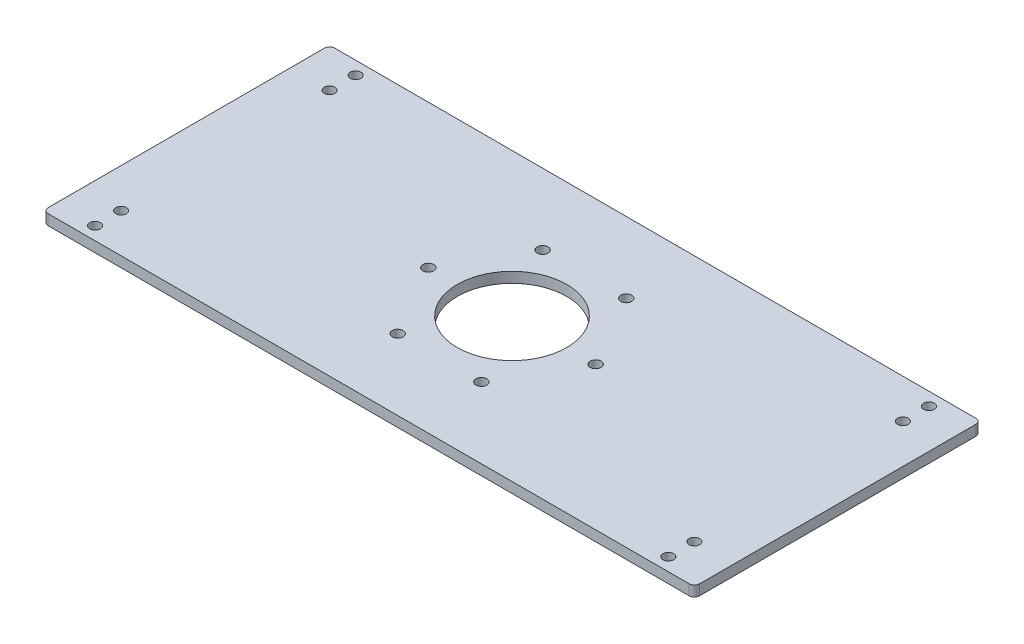
ISO-10303-21;
HEADER;
FILE_DESCRIPTION(('STEP AP214'),'2;1');
FILE_NAME('part.step','',(''),(''),'','','');
FILE_SCHEMA(('AUTOMOTIVE_DESIGN { 1 0 10303 214 1 1 1 1 }'));
ENDSEC;
DATA;
#1=APPLICATION_CONTEXT('core data for automotive mechanical design processes');
#2=APPLICATION_PROTOCOL_DEFINITION('international standard','automotive_design',2000,#1);
#3=PRODUCT_CONTEXT('',#1,'mechanical');
#4=PRODUCT('Part','Part','',(#3));
#5=PRODUCT_RELATED_PRODUCT_CATEGORY('part','',(#4));
#6=PRODUCT_DEFINITION_FORMATION('','',#4);
#7=PRODUCT_DEFINITION_CONTEXT('part definition',#1,'design');
#8=PRODUCT_DEFINITION('design','',#6,#7);
#9=PRODUCT_DEFINITION_SHAPE('','',#8);
#10=(LENGTH_UNIT() NAMED_UNIT(*) SI_UNIT(.MILLI.,.METRE.));
#11=(NAMED_UNIT(*) PLANE_ANGLE_UNIT() SI_UNIT($,.RADIAN.));
#12=(NAMED_UNIT(*) SI_UNIT($,.STERADIAN.) SOLID_ANGLE_UNIT());
#13=UNCERTAINTY_MEASURE_WITH_UNIT(LENGTH_MEASURE(1.E-05),#10,'distance_accuracy_value','');
#14=(GEOMETRIC_REPRESENTATION_CONTEXT(3) GLOBAL_UNCERTAINTY_ASSIGNED_CONTEXT((#13)) GLOBAL_UNIT_ASSIGNED_CONTEXT((#10,
#11,#12)) REPRESENTATION_CONTEXT('',''));
#15=CARTESIAN_POINT('',(0.,0.,0.));
#16=DIRECTION('',(0.,0.,1.));
#17=DIRECTION('',(1.,0.,0.));
#18=AXIS2_PLACEMENT_3D('',#15,#16,#17);
#19=CARTESIAN_POINT('',(125.,4.,-55.));
#20=DIRECTION('',(-1.,0.,0.));
#21=DIRECTION('',(0.,0.,1.));
#22=AXIS2_PLACEMENT_3D('',#19,#20,#21);
#23=PLANE('',#22);
#24=DIRECTION('',(0.,0.,-1.));
#25=VECTOR('',#24,1.);
#26=CARTESIAN_POINT('',(125.,0.,-55.));
#27=LINE('',#26,#25);
#28=CARTESIAN_POINT('',(125.,0.,53.));
#29=VERTEX_POINT('',#28);
#30=CARTESIAN_POINT('',(125.,0.,-53.));
#31=VERTEX_POINT('',#30);
#32=EDGE_CURVE('E134',#29,#31,#27,.T.);
#33=ORIENTED_EDGE('',*,*,#32,.T.);
#34=DIRECTION('',(0.,-1.,0.));
#35=VECTOR('',#34,1.);
#36=CARTESIAN_POINT('',(125.,4.,-53.));
#37=LINE('',#36,#35);
#38=CARTESIAN_POINT('',(125.,4.,-53.));
#39=VERTEX_POINT('',#38);
#40=EDGE_CURVE('E112',#31,#39,#37,.F.);
#41=ORIENTED_EDGE('',*,*,#40,.T.);
#42=DIRECTION('',(0.,0.,-1.));
#43=VECTOR('',#42,1.);
#44=CARTESIAN_POINT('',(125.,4.,-55.));
#45=LINE('',#44,#43);
#46=CARTESIAN_POINT('',(125.,4.,53.));
#47=VERTEX_POINT('',#46);
#48=EDGE_CURVE('E144',#47,#39,#45,.T.);
#49=ORIENTED_EDGE('',*,*,#48,.F.);
#50=DIRECTION('',(0.,-1.,0.));
#51=VECTOR('',#50,1.);
#52=CARTESIAN_POINT('',(125.,4.,53.));
#53=LINE('',#52,#51);
#54=EDGE_CURVE('E117',#47,#29,#53,.T.);
#55=ORIENTED_EDGE('',*,*,#54,.T.);
#56=EDGE_LOOP('',(#33,#41,#49,#55));
#57=FACE_BOUND('',#56,.T.);
#58=ADVANCED_FACE('F41',(#57),#23,.F.);
#59=CARTESIAN_POINT('',(-125.,4.,-55.));
#60=DIRECTION('',(0.,0.,1.));
#61=DIRECTION('',(1.,0.,0.));
#62=AXIS2_PLACEMENT_3D('',#59,#60,#61);
#63=PLANE('',#62);
#64=DIRECTION('',(-1.,0.,0.));
#65=VECTOR('',#64,1.);
#66=CARTESIAN_POINT('',(-125.,4.,-55.));
#67=LINE('',#66,#65);
#68=CARTESIAN_POINT('',(123.,4.,-55.));
#69=VERTEX_POINT('',#68);
#70=CARTESIAN_POINT('',(-123.,4.,-55.));
#71=VERTEX_POINT('',#70);
#72=EDGE_CURVE('E127',#69,#71,#67,.T.);
#73=ORIENTED_EDGE('',*,*,#72,.F.);
#74=DIRECTION('',(0.,-1.,0.));
#75=VECTOR('',#74,1.);
#76=CARTESIAN_POINT('',(123.,4.,-55.));
#77=LINE('',#76,#75);
#78=CARTESIAN_POINT('',(123.,0.,-55.));
#79=VERTEX_POINT('',#78);
#80=EDGE_CURVE('E111',#69,#79,#77,.T.);
#81=ORIENTED_EDGE('',*,*,#80,.T.);
#82=DIRECTION('',(-1.,0.,0.));
#83=VECTOR('',#82,1.);
#84=CARTESIAN_POINT('',(-125.,0.,-55.));
#85=LINE('',#84,#83);
#86=CARTESIAN_POINT('',(-123.,0.,-55.));
#87=VERTEX_POINT('',#86);
#88=EDGE_CURVE('E124',#79,#87,#85,.T.);
#89=ORIENTED_EDGE('',*,*,#88,.T.);
#90=DIRECTION('',(0.,-1.,0.));
#91=VECTOR('',#90,1.);
#92=CARTESIAN_POINT('',(-123.,4.,-55.));
#93=LINE('',#92,#91);
#94=EDGE_CURVE('E129',#87,#71,#93,.F.);
#95=ORIENTED_EDGE('',*,*,#94,.T.);
#96=EDGE_LOOP('',(#73,#81,#89,#95));
#97=FACE_BOUND('',#96,.T.);
#98=ADVANCED_FACE('F123',(#97),#63,.F.);
#99=CARTESIAN_POINT('',(-125.,4.,-55.));
#100=DIRECTION('',(1.,0.,0.));
#101=DIRECTION('',(0.,0.,-1.));
#102=AXIS2_PLACEMENT_3D('',#99,#100,#101);
#103=PLANE('',#102);
#104=DIRECTION('',(0.,0.,1.));
#105=VECTOR('',#104,1.);
#106=CARTESIAN_POINT('',(-125.,0.,-55.));
#107=LINE('',#106,#105);
#108=CARTESIAN_POINT('',(-125.,0.,-53.));
#109=VERTEX_POINT('',#108);
#110=CARTESIAN_POINT('',(-125.,0.,53.));
#111=VERTEX_POINT('',#110);
#112=EDGE_CURVE('E133',#109,#111,#107,.T.);
#113=ORIENTED_EDGE('',*,*,#112,.T.);
#114=DIRECTION('',(0.,-1.,0.));
#115=VECTOR('',#114,1.);
#116=CARTESIAN_POINT('',(-125.,4.,53.));
#117=LINE('',#116,#115);
#118=CARTESIAN_POINT('',(-125.,4.,53.));
#119=VERTEX_POINT('',#118);
#120=EDGE_CURVE('E11',#111,#119,#117,.F.);
#121=ORIENTED_EDGE('',*,*,#120,.T.);
#122=DIRECTION('',(0.,0.,1.));
#123=VECTOR('',#122,1.);
#124=CARTESIAN_POINT('',(-125.,4.,-55.));
#125=LINE('',#124,#123);
#126=CARTESIAN_POINT('',(-125.,4.,-53.));
#127=VERTEX_POINT('',#126);
#128=EDGE_CURVE('E218',#127,#119,#125,.T.);
#129=ORIENTED_EDGE('',*,*,#128,.F.);
#130=DIRECTION('',(0.,-1.,0.));
#131=VECTOR('',#130,1.);
#132=CARTESIAN_POINT('',(-125.,4.,-53.));
#133=LINE('',#132,#131);
#134=EDGE_CURVE('E49',#127,#109,#133,.T.);
#135=ORIENTED_EDGE('',*,*,#134,.T.);
#136=EDGE_LOOP('',(#113,#121,#129,#135));
#137=FACE_BOUND('',#136,.T.);
#138=ADVANCED_FACE('F216',(#137),#103,.F.);
#139=CARTESIAN_POINT('',(-125.,4.,55.));
#140=DIRECTION('',(0.,0.,-1.));
#141=DIRECTION('',(-1.,0.,0.));
#142=AXIS2_PLACEMENT_3D('',#139,#140,#141);
#143=PLANE('',#142);
#144=DIRECTION('',(1.,0.,0.));
#145=VECTOR('',#144,1.);
#146=CARTESIAN_POINT('',(-125.,0.,55.));
#147=LINE('',#146,#145);
#148=CARTESIAN_POINT('',(-123.,0.,55.));
#149=VERTEX_POINT('',#148);
#150=CARTESIAN_POINT('',(123.,0.,55.));
#151=VERTEX_POINT('',#150);
#152=EDGE_CURVE('E137',#149,#151,#147,.T.);
#153=ORIENTED_EDGE('',*,*,#152,.T.);
#154=DIRECTION('',(0.,-1.,0.));
#155=VECTOR('',#154,1.);
#156=CARTESIAN_POINT('',(123.,4.,55.));
#157=LINE('',#156,#155);
#158=CARTESIAN_POINT('',(123.,4.,55.));
#159=VERTEX_POINT('',#158);
#160=EDGE_CURVE('E56',#151,#159,#157,.F.);
#161=ORIENTED_EDGE('',*,*,#160,.T.);
#162=DIRECTION('',(1.,0.,0.));
#163=VECTOR('',#162,1.);
#164=CARTESIAN_POINT('',(-125.,4.,55.));
#165=LINE('',#164,#163);
#166=CARTESIAN_POINT('',(-123.,4.,55.));
#167=VERTEX_POINT('',#166);
#168=EDGE_CURVE('E193',#167,#159,#165,.T.);
#169=ORIENTED_EDGE('',*,*,#168,.F.);
#170=DIRECTION('',(0.,-1.,0.));
#171=VECTOR('',#170,1.);
#172=CARTESIAN_POINT('',(-123.,4.,55.));
#173=LINE('',#172,#171);
#174=EDGE_CURVE('E209',#167,#149,#173,.T.);
#175=ORIENTED_EDGE('',*,*,#174,.T.);
#176=EDGE_LOOP('',(#153,#161,#169,#175));
#177=FACE_BOUND('',#176,.T.);
#178=ADVANCED_FACE('F225',(#177),#143,.F.);
#179=CARTESIAN_POINT('',(0.,4.,0.));
#180=DIRECTION('',(0.,1.,0.));
#181=DIRECTION('',(0.,0.,1.));
#182=AXIS2_PLACEMENT_3D('',#179,#180,#181);
#183=PLANE('',#182);
#184=CARTESIAN_POINT('',(110.,4.,50.0000000000009));
#185=DIRECTION('',(0.,1.,0.));
#186=DIRECTION('',(0.,0.,1.));
#187=AXIS2_PLACEMENT_3D('',#184,#185,#186);
#188=CIRCLE('',#187,2.04999999999999);
#189=CARTESIAN_POINT('',(110.,4.,52.0500000000008));
#190=VERTEX_POINT('',#189);
#191=EDGE_CURVE('E259',#190,#190,#188,.T.);
#192=ORIENTED_EDGE('',*,*,#191,.F.);
#193=EDGE_LOOP('',(#192));
#194=FACE_BOUND('',#193,.T.);
#195=CARTESIAN_POINT('',(110.,4.,-50.0000000000003));
#196=DIRECTION('',(0.,1.,0.));
#197=DIRECTION('',(0.,0.,-1.));
#198=AXIS2_PLACEMENT_3D('',#195,#196,#197);
#199=CIRCLE('',#198,2.04999999999999);
#200=CARTESIAN_POINT('',(110.,4.,-52.0500000000003));
#201=VERTEX_POINT('',#200);
#202=EDGE_CURVE('E256',#201,#201,#199,.T.);
#203=ORIENTED_EDGE('',*,*,#202,.F.);
#204=EDGE_LOOP('',(#203));
#205=FACE_BOUND('',#204,.T.);
#206=CARTESIAN_POINT('',(110.,4.,-40.0000000000003));
#207=DIRECTION('',(0.,1.,0.));
#208=DIRECTION('',(0.,0.,-1.));
#209=AXIS2_PLACEMENT_3D('',#206,#207,#208);
#210=CIRCLE('',#209,2.04999999999999);
#211=CARTESIAN_POINT('',(110.,4.,-42.0500000000003));
#212=VERTEX_POINT('',#211);
#213=EDGE_CURVE('E253',#212,#212,#210,.T.);
#214=ORIENTED_EDGE('',*,*,#213,.F.);
#215=EDGE_LOOP('',(#214));
#216=FACE_BOUND('',#215,.T.);
#217=CARTESIAN_POINT('',(-110.,4.,-40.));
#218=DIRECTION('',(0.,1.,0.));
#219=DIRECTION('',(0.,0.,1.));
#220=AXIS2_PLACEMENT_3D('',#217,#218,#219);
#221=CIRCLE('',#220,2.04999999999999);
#222=CARTESIAN_POINT('',(-110.,4.,-37.95));
#223=VERTEX_POINT('',#222);
#224=EDGE_CURVE('E252',#223,#223,#221,.T.);
#225=ORIENTED_EDGE('',*,*,#224,.F.);
#226=EDGE_LOOP('',(#225));
#227=FACE_BOUND('',#226,.T.);
#228=CARTESIAN_POINT('',(-110.,4.,40.));
#229=DIRECTION('',(0.,1.,0.));
#230=DIRECTION('',(0.,0.,-1.));
#231=AXIS2_PLACEMENT_3D('',#228,#229,#230);
#232=CIRCLE('',#231,2.04999999999999);
#233=CARTESIAN_POINT('',(-110.,4.,37.95));
#234=VERTEX_POINT('',#233);
#235=EDGE_CURVE('E268',#234,#234,#232,.T.);
#236=ORIENTED_EDGE('',*,*,#235,.F.);
#237=EDGE_LOOP('',(#236));
#238=FACE_BOUND('',#237,.T.);
#239=CARTESIAN_POINT('',(-110.,4.,50.));
#240=DIRECTION('',(0.,1.,0.));
#241=DIRECTION('',(0.,0.,-1.));
#242=AXIS2_PLACEMENT_3D('',#239,#240,#241);
#243=CIRCLE('',#242,2.04999999999999);
#244=CARTESIAN_POINT('',(-110.,4.,47.95));
#245=VERTEX_POINT('',#244);
#246=EDGE_CURVE('E265',#245,#245,#243,.T.);
#247=ORIENTED_EDGE('',*,*,#246,.F.);
#248=EDGE_LOOP('',(#247));
#249=FACE_BOUND('',#248,.T.);
#250=CARTESIAN_POINT('',(110.,4.,40.0000000000009));
#251=DIRECTION('',(0.,1.,0.));
#252=DIRECTION('',(0.,0.,1.));
#253=AXIS2_PLACEMENT_3D('',#250,#251,#252);
#254=CIRCLE('',#253,2.04999999999999);
#255=CARTESIAN_POINT('',(110.,4.,42.0500000000008));
#256=VERTEX_POINT('',#255);
#257=EDGE_CURVE('E262',#256,#256,#254,.T.);
#258=ORIENTED_EDGE('',*,*,#257,.F.);
#259=EDGE_LOOP('',(#258));
#260=FACE_BOUND('',#259,.T.);
#261=CARTESIAN_POINT('',(-110.,4.,-50.));
#262=DIRECTION('',(0.,1.,0.));
#263=DIRECTION('',(0.,0.,1.));
#264=AXIS2_PLACEMENT_3D('',#261,#262,#263);
#265=CIRCLE('',#264,2.04999999999999);
#266=CARTESIAN_POINT('',(-110.,4.,-47.95));
#267=VERTEX_POINT('',#266);
#268=EDGE_CURVE('E172',#267,#267,#265,.T.);
#269=ORIENTED_EDGE('',*,*,#268,.F.);
#270=EDGE_LOOP('',(#269));
#271=FACE_BOUND('',#270,.T.);
#272=CARTESIAN_POINT('',(0.,4.,0.));
#273=DIRECTION('',(0.,1.,0.));
#274=DIRECTION('',(0.,0.,1.));
#275=AXIS2_PLACEMENT_3D('',#272,#273,#274);
#276=CIRCLE('',#275,21.);
#277=CARTESIAN_POINT('',(0.,4.,21.));
#278=VERTEX_POINT('',#277);
#279=EDGE_CURVE('E167',#278,#278,#276,.T.);
#280=ORIENTED_EDGE('',*,*,#279,.F.);
#281=EDGE_LOOP('',(#280));
#282=FACE_BOUND('',#281,.T.);
#283=CARTESIAN_POINT('',(-32.1,4.,0.));
#284=DIRECTION('',(0.,1.,0.));
#285=DIRECTION('',(0.,0.,1.));
#286=AXIS2_PLACEMENT_3D('',#283,#284,#285);
#287=CIRCLE('',#286,2.1);
#288=CARTESIAN_POINT('',(-32.1,4.,2.1));
#289=VERTEX_POINT('',#288);
#290=EDGE_CURVE('E149',#289,#289,#287,.T.);
#291=ORIENTED_EDGE('',*,*,#290,.F.);
#292=EDGE_LOOP('',(#291));
#293=FACE_BOUND('',#292,.T.);
#294=CARTESIAN_POINT('',(-16.05,4.,27.7994154614805));
#295=DIRECTION('',(0.,1.,0.));
#296=DIRECTION('',(0.,0.,1.));
#297=AXIS2_PLACEMENT_3D('',#294,#295,#296);
#298=CIRCLE('',#297,2.1);
#299=CARTESIAN_POINT('',(-16.05,4.,29.8994154614805));
#300=VERTEX_POINT('',#299);
#301=EDGE_CURVE('E166',#300,#300,#298,.T.);
#302=ORIENTED_EDGE('',*,*,#301,.F.);
#303=EDGE_LOOP('',(#302));
#304=FACE_BOUND('',#303,.T.);
#305=CARTESIAN_POINT('',(16.05,4.,27.7994154614805));
#306=DIRECTION('',(0.,1.,0.));
#307=DIRECTION('',(0.,0.,1.));
#308=AXIS2_PLACEMENT_3D('',#305,#306,#307);
#309=CIRCLE('',#308,2.1);
#310=CARTESIAN_POINT('',(16.05,4.,29.8994154614805));
#311=VERTEX_POINT('',#310);
#312=EDGE_CURVE('E232',#311,#311,#309,.T.);
#313=ORIENTED_EDGE('',*,*,#312,.F.);
#314=EDGE_LOOP('',(#313));
#315=FACE_BOUND('',#314,.T.);
#316=CARTESIAN_POINT('',(32.1,4.,0.));
#317=DIRECTION('',(0.,1.,0.));
#318=DIRECTION('',(0.,0.,1.));
#319=AXIS2_PLACEMENT_3D('',#316,#317,#318);
#320=CIRCLE('',#319,2.1);
#321=CARTESIAN_POINT('',(32.1,4.,2.1));
#322=VERTEX_POINT('',#321);
#323=EDGE_CURVE('E235',#322,#322,#320,.T.);
#324=ORIENTED_EDGE('',*,*,#323,.F.);
#325=EDGE_LOOP('',(#324));
#326=FACE_BOUND('',#325,.T.);
#327=CARTESIAN_POINT('',(16.05,4.,-27.7994154614805));
#328=DIRECTION('',(0.,1.,0.));
#329=DIRECTION('',(0.,0.,1.));
#330=AXIS2_PLACEMENT_3D('',#327,#328,#329);
#331=CIRCLE('',#330,2.1);
#332=CARTESIAN_POINT('',(16.05,4.,-25.6994154614805));
#333=VERTEX_POINT('',#332);
#334=EDGE_CURVE('E238',#333,#333,#331,.T.);
#335=ORIENTED_EDGE('',*,*,#334,.F.);
#336=EDGE_LOOP('',(#335));
#337=FACE_BOUND('',#336,.T.);
#338=CARTESIAN_POINT('',(-16.05,4.,-27.7994154614805));
#339=DIRECTION('',(0.,1.,0.));
#340=DIRECTION('',(0.,0.,1.));
#341=AXIS2_PLACEMENT_3D('',#338,#339,#340);
#342=CIRCLE('',#341,2.10000000000008);
#343=CARTESIAN_POINT('',(-16.05,4.,-25.6994154614804));
#344=VERTEX_POINT('',#343);
#345=EDGE_CURVE('E241',#344,#344,#342,.T.);
#346=ORIENTED_EDGE('',*,*,#345,.F.);
#347=EDGE_LOOP('',(#346));
#348=FACE_BOUND('',#347,.T.);
#349=ORIENTED_EDGE('',*,*,#48,.T.);
#350=CARTESIAN_POINT('',(123.,4.,-53.));
#351=DIRECTION('',(0.,1.,0.));
#352=DIRECTION('',(0.,0.,1.));
#353=AXIS2_PLACEMENT_3D('',#350,#351,#352);
#354=CIRCLE('',#353,2.);
#355=EDGE_CURVE('E207',#39,#69,#354,.T.);
#356=ORIENTED_EDGE('',*,*,#355,.T.);
#357=ORIENTED_EDGE('',*,*,#72,.T.);
#358=CARTESIAN_POINT('',(-123.,4.,-53.));
#359=DIRECTION('',(0.,1.,0.));
#360=DIRECTION('',(0.,0.,1.));
#361=AXIS2_PLACEMENT_3D('',#358,#359,#360);
#362=CIRCLE('',#361,2.);
#363=EDGE_CURVE('E202',#71,#127,#362,.T.);
#364=ORIENTED_EDGE('',*,*,#363,.T.);
#365=ORIENTED_EDGE('',*,*,#128,.T.);
#366=CARTESIAN_POINT('',(-123.,4.,53.));
#367=DIRECTION('',(0.,1.,0.));
#368=DIRECTION('',(0.,0.,1.));
#369=AXIS2_PLACEMENT_3D('',#366,#367,#368);
#370=CIRCLE('',#369,2.);
#371=EDGE_CURVE('E63',#119,#167,#370,.T.);
#372=ORIENTED_EDGE('',*,*,#371,.T.);
#373=ORIENTED_EDGE('',*,*,#168,.T.);
#374=CARTESIAN_POINT('',(123.,4.,53.));
#375=DIRECTION('',(0.,1.,0.));
#376=DIRECTION('',(0.,0.,1.));
#377=AXIS2_PLACEMENT_3D('',#374,#375,#376);
#378=CIRCLE('',#377,2.);
#379=EDGE_CURVE('E205',#159,#47,#378,.T.);
#380=ORIENTED_EDGE('',*,*,#379,.T.);
#381=EDGE_LOOP('',(#349,#356,#357,#364,#365,#372,#373,#380));
#382=FACE_BOUND('',#381,.T.);
#383=ADVANCED_FACE('F277',(#194,#205,#216,#227,#238,#249,#260,#271,#282,#293,#304,#315,#326,
#337,#348,#382),#183,.T.);
#384=CARTESIAN_POINT('',(0.,0.,0.));
#385=DIRECTION('',(0.,1.,0.));
#386=DIRECTION('',(0.,0.,1.));
#387=AXIS2_PLACEMENT_3D('',#384,#385,#386);
#388=PLANE('',#387);
#389=CARTESIAN_POINT('',(110.,0.,50.0000000000009));
#390=DIRECTION('',(0.,1.,0.));
#391=DIRECTION('',(0.,0.,1.));
#392=AXIS2_PLACEMENT_3D('',#389,#390,#391);
#393=CIRCLE('',#392,2.04999999999999);
#394=CARTESIAN_POINT('',(110.,0.,52.0500000000008));
#395=VERTEX_POINT('',#394);
#396=EDGE_CURVE('E190',#395,#395,#393,.T.);
#397=ORIENTED_EDGE('',*,*,#396,.T.);
#398=EDGE_LOOP('',(#397));
#399=FACE_BOUND('',#398,.T.);
#400=CARTESIAN_POINT('',(110.,0.,-50.0000000000003));
#401=DIRECTION('',(0.,1.,0.));
#402=DIRECTION('',(0.,0.,1.));
#403=AXIS2_PLACEMENT_3D('',#400,#401,#402);
#404=CIRCLE('',#403,2.04999999999999);
#405=CARTESIAN_POINT('',(110.,0.,-47.9500000000004));
#406=VERTEX_POINT('',#405);
#407=EDGE_CURVE('E187',#406,#406,#404,.T.);
#408=ORIENTED_EDGE('',*,*,#407,.T.);
#409=EDGE_LOOP('',(#408));
#410=FACE_BOUND('',#409,.T.);
#411=CARTESIAN_POINT('',(110.,0.,-40.0000000000003));
#412=DIRECTION('',(0.,1.,0.));
#413=DIRECTION('',(0.,0.,1.));
#414=AXIS2_PLACEMENT_3D('',#411,#412,#413);
#415=CIRCLE('',#414,2.04999999999999);
#416=CARTESIAN_POINT('',(110.,0.,-37.9500000000004));
#417=VERTEX_POINT('',#416);
#418=EDGE_CURVE('E184',#417,#417,#415,.T.);
#419=ORIENTED_EDGE('',*,*,#418,.T.);
#420=EDGE_LOOP('',(#419));
#421=FACE_BOUND('',#420,.T.);
#422=CARTESIAN_POINT('',(-110.,0.,-40.));
#423=DIRECTION('',(0.,1.,0.));
#424=DIRECTION('',(0.,0.,1.));
#425=AXIS2_PLACEMENT_3D('',#422,#423,#424);
#426=CIRCLE('',#425,2.04999999999999);
#427=CARTESIAN_POINT('',(-110.,0.,-37.95));
#428=VERTEX_POINT('',#427);
#429=EDGE_CURVE('E181',#428,#428,#426,.T.);
#430=ORIENTED_EDGE('',*,*,#429,.T.);
#431=EDGE_LOOP('',(#430));
#432=FACE_BOUND('',#431,.T.);
#433=CARTESIAN_POINT('',(-110.,0.,40.));
#434=DIRECTION('',(0.,1.,0.));
#435=DIRECTION('',(0.,0.,1.));
#436=AXIS2_PLACEMENT_3D('',#433,#434,#435);
#437=CIRCLE('',#436,2.04999999999999);
#438=CARTESIAN_POINT('',(-110.,0.,42.05));
#439=VERTEX_POINT('',#438);
#440=EDGE_CURVE('E178',#439,#439,#437,.T.);
#441=ORIENTED_EDGE('',*,*,#440,.T.);
#442=EDGE_LOOP('',(#441));
#443=FACE_BOUND('',#442,.T.);
#444=CARTESIAN_POINT('',(-110.,0.,50.));
#445=DIRECTION('',(0.,1.,0.));
#446=DIRECTION('',(0.,0.,1.));
#447=AXIS2_PLACEMENT_3D('',#444,#445,#446);
#448=CIRCLE('',#447,2.04999999999999);
#449=CARTESIAN_POINT('',(-110.,0.,52.05));
#450=VERTEX_POINT('',#449);
#451=EDGE_CURVE('E175',#450,#450,#448,.T.);
#452=ORIENTED_EDGE('',*,*,#451,.T.);
#453=EDGE_LOOP('',(#452));
#454=FACE_BOUND('',#453,.T.);
#455=CARTESIAN_POINT('',(110.,0.,40.0000000000009));
#456=DIRECTION('',(0.,1.,0.));
#457=DIRECTION('',(0.,0.,1.));
#458=AXIS2_PLACEMENT_3D('',#455,#456,#457);
#459=CIRCLE('',#458,2.04999999999999);
#460=CARTESIAN_POINT('',(110.,0.,42.0500000000008));
#461=VERTEX_POINT('',#460);
#462=EDGE_CURVE('E171',#461,#461,#459,.T.);
#463=ORIENTED_EDGE('',*,*,#462,.T.);
#464=EDGE_LOOP('',(#463));
#465=FACE_BOUND('',#464,.T.);
#466=CARTESIAN_POINT('',(-110.,0.,-50.));
#467=DIRECTION('',(0.,1.,0.));
#468=DIRECTION('',(0.,0.,1.));
#469=AXIS2_PLACEMENT_3D('',#466,#467,#468);
#470=CIRCLE('',#469,2.04999999999999);
#471=CARTESIAN_POINT('',(-110.,0.,-47.95));
#472=VERTEX_POINT('',#471);
#473=EDGE_CURVE('E168',#472,#472,#470,.T.);
#474=ORIENTED_EDGE('',*,*,#473,.T.);
#475=EDGE_LOOP('',(#474));
#476=FACE_BOUND('',#475,.T.);
#477=CARTESIAN_POINT('',(0.,0.,0.));
#478=DIRECTION('',(0.,1.,0.));
#479=DIRECTION('',(0.,0.,1.));
#480=AXIS2_PLACEMENT_3D('',#477,#478,#479);
#481=CIRCLE('',#480,21.);
#482=CARTESIAN_POINT('',(0.,0.,21.));
#483=VERTEX_POINT('',#482);
#484=EDGE_CURVE('E163',#483,#483,#481,.T.);
#485=ORIENTED_EDGE('',*,*,#484,.T.);
#486=EDGE_LOOP('',(#485));
#487=FACE_BOUND('',#486,.T.);
#488=CARTESIAN_POINT('',(-32.1,0.,0.));
#489=DIRECTION('',(0.,1.,0.));
#490=DIRECTION('',(0.,0.,1.));
#491=AXIS2_PLACEMENT_3D('',#488,#489,#490);
#492=CIRCLE('',#491,2.1);
#493=CARTESIAN_POINT('',(-32.1,0.,2.1));
#494=VERTEX_POINT('',#493);
#495=EDGE_CURVE('E139',#494,#494,#492,.T.);
#496=ORIENTED_EDGE('',*,*,#495,.T.);
#497=EDGE_LOOP('',(#496));
#498=FACE_BOUND('',#497,.T.);
#499=CARTESIAN_POINT('',(-16.05,0.,27.7994154614805));
#500=DIRECTION('',(0.,1.,0.));
#501=DIRECTION('',(0.,0.,1.));
#502=AXIS2_PLACEMENT_3D('',#499,#500,#501);
#503=CIRCLE('',#502,2.1);
#504=CARTESIAN_POINT('',(-16.05,0.,29.8994154614805));
#505=VERTEX_POINT('',#504);
#506=EDGE_CURVE('E158',#505,#505,#503,.T.);
#507=ORIENTED_EDGE('',*,*,#506,.T.);
#508=EDGE_LOOP('',(#507));
#509=FACE_BOUND('',#508,.T.);
#510=CARTESIAN_POINT('',(16.05,0.,27.7994154614805));
#511=DIRECTION('',(0.,1.,0.));
#512=DIRECTION('',(0.,0.,1.));
#513=AXIS2_PLACEMENT_3D('',#510,#511,#512);
#514=CIRCLE('',#513,2.1);
#515=CARTESIAN_POINT('',(16.05,0.,29.8994154614805));
#516=VERTEX_POINT('',#515);
#517=EDGE_CURVE('E155',#516,#516,#514,.T.);
#518=ORIENTED_EDGE('',*,*,#517,.T.);
#519=EDGE_LOOP('',(#518));
#520=FACE_BOUND('',#519,.T.);
#521=CARTESIAN_POINT('',(32.1,0.,0.));
#522=DIRECTION('',(0.,1.,0.));
#523=DIRECTION('',(0.,0.,1.));
#524=AXIS2_PLACEMENT_3D('',#521,#522,#523);
#525=CIRCLE('',#524,2.1);
#526=CARTESIAN_POINT('',(32.1,0.,2.1));
#527=VERTEX_POINT('',#526);
#528=EDGE_CURVE('E152',#527,#527,#525,.T.);
#529=ORIENTED_EDGE('',*,*,#528,.T.);
#530=EDGE_LOOP('',(#529));
#531=FACE_BOUND('',#530,.T.);
#532=CARTESIAN_POINT('',(16.05,0.,-27.7994154614805));
#533=DIRECTION('',(0.,1.,0.));
#534=DIRECTION('',(0.,0.,1.));
#535=AXIS2_PLACEMENT_3D('',#532,#533,#534);
#536=CIRCLE('',#535,2.1);
#537=CARTESIAN_POINT('',(16.05,0.,-25.6994154614805));
#538=VERTEX_POINT('',#537);
#539=EDGE_CURVE('E148',#538,#538,#536,.T.);
#540=ORIENTED_EDGE('',*,*,#539,.T.);
#541=EDGE_LOOP('',(#540));
#542=FACE_BOUND('',#541,.T.);
#543=CARTESIAN_POINT('',(-16.05,0.,-27.7994154614805));
#544=DIRECTION('',(0.,1.,0.));
#545=DIRECTION('',(0.,0.,1.));
#546=AXIS2_PLACEMENT_3D('',#543,#544,#545);
#547=CIRCLE('',#546,2.10000000000008);
#548=CARTESIAN_POINT('',(-16.05,0.,-25.6994154614804));
#549=VERTEX_POINT('',#548);
#550=EDGE_CURVE('E145',#549,#549,#547,.T.);
#551=ORIENTED_EDGE('',*,*,#550,.T.);
#552=EDGE_LOOP('',(#551));
#553=FACE_BOUND('',#552,.T.);
#554=ORIENTED_EDGE('',*,*,#88,.F.);
#555=CARTESIAN_POINT('',(123.,0.,-53.));
#556=DIRECTION('',(0.,1.,0.));
#557=DIRECTION('',(0.,0.,1.));
#558=AXIS2_PLACEMENT_3D('',#555,#556,#557);
#559=CIRCLE('',#558,2.);
#560=EDGE_CURVE('E107',#79,#31,#559,.F.);
#561=ORIENTED_EDGE('',*,*,#560,.T.);
#562=ORIENTED_EDGE('',*,*,#32,.F.);
#563=CARTESIAN_POINT('',(123.,0.,53.));
#564=DIRECTION('',(0.,1.,0.));
#565=DIRECTION('',(0.,0.,1.));
#566=AXIS2_PLACEMENT_3D('',#563,#564,#565);
#567=CIRCLE('',#566,2.);
#568=EDGE_CURVE('E118',#29,#151,#567,.F.);
#569=ORIENTED_EDGE('',*,*,#568,.T.);
#570=ORIENTED_EDGE('',*,*,#152,.F.);
#571=CARTESIAN_POINT('',(-123.,0.,53.));
#572=DIRECTION('',(0.,1.,0.));
#573=DIRECTION('',(0.,0.,1.));
#574=AXIS2_PLACEMENT_3D('',#571,#572,#573);
#575=CIRCLE('',#574,2.);
#576=EDGE_CURVE('E196',#149,#111,#575,.F.);
#577=ORIENTED_EDGE('',*,*,#576,.T.);
#578=ORIENTED_EDGE('',*,*,#112,.F.);
#579=CARTESIAN_POINT('',(-123.,0.,-53.));
#580=DIRECTION('',(0.,1.,0.));
#581=DIRECTION('',(0.,0.,1.));
#582=AXIS2_PLACEMENT_3D('',#579,#580,#581);
#583=CIRCLE('',#582,2.);
#584=EDGE_CURVE('E128',#109,#87,#583,.F.);
#585=ORIENTED_EDGE('',*,*,#584,.T.);
#586=EDGE_LOOP('',(#554,#561,#562,#569,#570,#577,#578,#585));
#587=FACE_BOUND('',#586,.T.);
#588=ADVANCED_FACE('F131',(#399,#410,#421,#432,#443,#454,#465,#476,#487,#498,#509,#520,#531,
#542,#553,#587),#388,.F.);
#589=CARTESIAN_POINT('',(-16.05,-6.,-27.7994154614805));
#590=DIRECTION('',(0.,1.,0.));
#591=DIRECTION('',(0.,0.,1.));
#592=AXIS2_PLACEMENT_3D('',#589,#590,#591);
#593=CYLINDRICAL_SURFACE('',#592,2.10000000000008);
#594=ORIENTED_EDGE('',*,*,#345,.T.);
#595=EDGE_LOOP('',(#594));
#596=FACE_BOUND('',#595,.T.);
#597=ORIENTED_EDGE('',*,*,#550,.F.);
#598=EDGE_LOOP('',(#597));
#599=FACE_BOUND('',#598,.T.);
#600=ADVANCED_FACE('F327',(#596,#599),#593,.F.);
#601=CARTESIAN_POINT('',(16.05,-6.,-27.7994154614805));
#602=DIRECTION('',(0.,1.,0.));
#603=DIRECTION('',(0.,0.,1.));
#604=AXIS2_PLACEMENT_3D('',#601,#602,#603);
#605=CYLINDRICAL_SURFACE('',#604,2.1);
#606=ORIENTED_EDGE('',*,*,#334,.T.);
#607=EDGE_LOOP('',(#606));
#608=FACE_BOUND('',#607,.T.);
#609=ORIENTED_EDGE('',*,*,#539,.F.);
#610=EDGE_LOOP('',(#609));
#611=FACE_BOUND('',#610,.T.);
#612=ADVANCED_FACE('F338',(#608,#611),#605,.F.);
#613=CARTESIAN_POINT('',(32.1,-6.,0.));
#614=DIRECTION('',(0.,1.,0.));
#615=DIRECTION('',(0.,0.,1.));
#616=AXIS2_PLACEMENT_3D('',#613,#614,#615);
#617=CYLINDRICAL_SURFACE('',#616,2.1);
#618=ORIENTED_EDGE('',*,*,#323,.T.);
#619=EDGE_LOOP('',(#618));
#620=FACE_BOUND('',#619,.T.);
#621=ORIENTED_EDGE('',*,*,#528,.F.);
#622=EDGE_LOOP('',(#621));
#623=FACE_BOUND('',#622,.T.);
#624=ADVANCED_FACE('F334',(#620,#623),#617,.F.);
#625=CARTESIAN_POINT('',(16.05,-6.,27.7994154614805));
#626=DIRECTION('',(0.,1.,0.));
#627=DIRECTION('',(0.,0.,1.));
#628=AXIS2_PLACEMENT_3D('',#625,#626,#627);
#629=CYLINDRICAL_SURFACE('',#628,2.1);
#630=ORIENTED_EDGE('',*,*,#312,.T.);
#631=EDGE_LOOP('',(#630));
#632=FACE_BOUND('',#631,.T.);
#633=ORIENTED_EDGE('',*,*,#517,.F.);
#634=EDGE_LOOP('',(#633));
#635=FACE_BOUND('',#634,.T.);
#636=ADVANCED_FACE('F330',(#632,#635),#629,.F.);
#637=CARTESIAN_POINT('',(-16.05,-6.,27.7994154614805));
#638=DIRECTION('',(0.,1.,0.));
#639=DIRECTION('',(0.,0.,1.));
#640=AXIS2_PLACEMENT_3D('',#637,#638,#639);
#641=CYLINDRICAL_SURFACE('',#640,2.1);
#642=ORIENTED_EDGE('',*,*,#301,.T.);
#643=EDGE_LOOP('',(#642));
#644=FACE_BOUND('',#643,.T.);
#645=ORIENTED_EDGE('',*,*,#506,.F.);
#646=EDGE_LOOP('',(#645));
#647=FACE_BOUND('',#646,.T.);
#648=ADVANCED_FACE('F333',(#644,#647),#641,.F.);
#649=CARTESIAN_POINT('',(-32.1,-6.,0.));
#650=DIRECTION('',(0.,1.,0.));
#651=DIRECTION('',(0.,0.,1.));
#652=AXIS2_PLACEMENT_3D('',#649,#650,#651);
#653=CYLINDRICAL_SURFACE('',#652,2.1);
#654=ORIENTED_EDGE('',*,*,#290,.T.);
#655=EDGE_LOOP('',(#654));
#656=FACE_BOUND('',#655,.T.);
#657=ORIENTED_EDGE('',*,*,#495,.F.);
#658=EDGE_LOOP('',(#657));
#659=FACE_BOUND('',#658,.T.);
#660=ADVANCED_FACE('F348',(#656,#659),#653,.F.);
#661=CARTESIAN_POINT('',(0.,-6.,0.));
#662=DIRECTION('',(0.,1.,0.));
#663=DIRECTION('',(0.,0.,1.));
#664=AXIS2_PLACEMENT_3D('',#661,#662,#663);
#665=CYLINDRICAL_SURFACE('',#664,21.);
#666=ORIENTED_EDGE('',*,*,#279,.T.);
#667=EDGE_LOOP('',(#666));
#668=FACE_BOUND('',#667,.T.);
#669=ORIENTED_EDGE('',*,*,#484,.F.);
#670=EDGE_LOOP('',(#669));
#671=FACE_BOUND('',#670,.T.);
#672=ADVANCED_FACE('F352',(#668,#671),#665,.F.);
#673=CARTESIAN_POINT('',(-110.,-6.,-50.));
#674=DIRECTION('',(0.,1.,0.));
#675=DIRECTION('',(0.,0.,1.));
#676=AXIS2_PLACEMENT_3D('',#673,#674,#675);
#677=CYLINDRICAL_SURFACE('',#676,2.04999999999999);
#678=ORIENTED_EDGE('',*,*,#268,.T.);
#679=EDGE_LOOP('',(#678));
#680=FACE_BOUND('',#679,.T.);
#681=ORIENTED_EDGE('',*,*,#473,.F.);
#682=EDGE_LOOP('',(#681));
#683=FACE_BOUND('',#682,.T.);
#684=ADVANCED_FACE('F356',(#680,#683),#677,.F.);
#685=CARTESIAN_POINT('',(110.,-6.,40.0000000000009));
#686=DIRECTION('',(0.,1.,0.));
#687=DIRECTION('',(0.,0.,1.));
#688=AXIS2_PLACEMENT_3D('',#685,#686,#687);
#689=CYLINDRICAL_SURFACE('',#688,2.04999999999999);
#690=ORIENTED_EDGE('',*,*,#257,.T.);
#691=EDGE_LOOP('',(#690));
#692=FACE_BOUND('',#691,.T.);
#693=ORIENTED_EDGE('',*,*,#462,.F.);
#694=EDGE_LOOP('',(#693));
#695=FACE_BOUND('',#694,.T.);
#696=ADVANCED_FACE('F360',(#692,#695),#689,.F.);
#697=CARTESIAN_POINT('',(-110.,-6.,50.));
#698=DIRECTION('',(0.,1.,0.));
#699=DIRECTION('',(0.,0.,1.));
#700=AXIS2_PLACEMENT_3D('',#697,#698,#699);
#701=CYLINDRICAL_SURFACE('',#700,2.04999999999999);
#702=ORIENTED_EDGE('',*,*,#246,.T.);
#703=EDGE_LOOP('',(#702));
#704=FACE_BOUND('',#703,.T.);
#705=ORIENTED_EDGE('',*,*,#451,.F.);
#706=EDGE_LOOP('',(#705));
#707=FACE_BOUND('',#706,.T.);
#708=ADVANCED_FACE('F376',(#704,#707),#701,.F.);
#709=CARTESIAN_POINT('',(-110.,-6.,40.));
#710=DIRECTION('',(0.,1.,0.));
#711=DIRECTION('',(0.,0.,1.));
#712=AXIS2_PLACEMENT_3D('',#709,#710,#711);
#713=CYLINDRICAL_SURFACE('',#712,2.04999999999999);
#714=ORIENTED_EDGE('',*,*,#235,.T.);
#715=EDGE_LOOP('',(#714));
#716=FACE_BOUND('',#715,.T.);
#717=ORIENTED_EDGE('',*,*,#440,.F.);
#718=EDGE_LOOP('',(#717));
#719=FACE_BOUND('',#718,.T.);
#720=ADVANCED_FACE('F274',(#716,#719),#713,.F.);
#721=CARTESIAN_POINT('',(-110.,-6.,-40.));
#722=DIRECTION('',(0.,1.,0.));
#723=DIRECTION('',(0.,0.,1.));
#724=AXIS2_PLACEMENT_3D('',#721,#722,#723);
#725=CYLINDRICAL_SURFACE('',#724,2.04999999999999);
#726=ORIENTED_EDGE('',*,*,#224,.T.);
#727=EDGE_LOOP('',(#726));
#728=FACE_BOUND('',#727,.T.);
#729=ORIENTED_EDGE('',*,*,#429,.F.);
#730=EDGE_LOOP('',(#729));
#731=FACE_BOUND('',#730,.T.);
#732=ADVANCED_FACE('F366',(#728,#731),#725,.F.);
#733=CARTESIAN_POINT('',(110.,-6.,-40.0000000000003));
#734=DIRECTION('',(0.,1.,0.));
#735=DIRECTION('',(0.,0.,1.));
#736=AXIS2_PLACEMENT_3D('',#733,#734,#735);
#737=CYLINDRICAL_SURFACE('',#736,2.04999999999999);
#738=ORIENTED_EDGE('',*,*,#213,.T.);
#739=EDGE_LOOP('',(#738));
#740=FACE_BOUND('',#739,.T.);
#741=ORIENTED_EDGE('',*,*,#418,.F.);
#742=EDGE_LOOP('',(#741));
#743=FACE_BOUND('',#742,.T.);
#744=ADVANCED_FACE('F362',(#740,#743),#737,.F.);
#745=CARTESIAN_POINT('',(110.,-6.,-50.0000000000003));
#746=DIRECTION('',(0.,1.,0.));
#747=DIRECTION('',(0.,0.,1.));
#748=AXIS2_PLACEMENT_3D('',#745,#746,#747);
#749=CYLINDRICAL_SURFACE('',#748,2.04999999999999);
#750=ORIENTED_EDGE('',*,*,#202,.T.);
#751=EDGE_LOOP('',(#750));
#752=FACE_BOUND('',#751,.T.);
#753=ORIENTED_EDGE('',*,*,#407,.F.);
#754=EDGE_LOOP('',(#753));
#755=FACE_BOUND('',#754,.T.);
#756=ADVANCED_FACE('F365',(#752,#755),#749,.F.);
#757=CARTESIAN_POINT('',(110.,-6.,50.0000000000009));
#758=DIRECTION('',(0.,1.,0.));
#759=DIRECTION('',(0.,0.,1.));
#760=AXIS2_PLACEMENT_3D('',#757,#758,#759);
#761=CYLINDRICAL_SURFACE('',#760,2.04999999999999);
#762=ORIENTED_EDGE('',*,*,#191,.T.);
#763=EDGE_LOOP('',(#762));
#764=FACE_BOUND('',#763,.T.);
#765=ORIENTED_EDGE('',*,*,#396,.F.);
#766=EDGE_LOOP('',(#765));
#767=FACE_BOUND('',#766,.T.);
#768=ADVANCED_FACE('F312',(#764,#767),#761,.F.);
#769=CARTESIAN_POINT('',(123.,4.,-53.));
#770=DIRECTION('',(0.,-1.,0.));
#771=DIRECTION('',(0.,0.,-1.));
#772=AXIS2_PLACEMENT_3D('',#769,#770,#771);
#773=CYLINDRICAL_SURFACE('',#772,2.);
#774=ORIENTED_EDGE('',*,*,#355,.F.);
#775=ORIENTED_EDGE('',*,*,#40,.F.);
#776=ORIENTED_EDGE('',*,*,#560,.F.);
#777=ORIENTED_EDGE('',*,*,#80,.F.);
#778=EDGE_LOOP('',(#774,#775,#776,#777));
#779=FACE_BOUND('',#778,.T.);
#780=ADVANCED_FACE('F110',(#779),#773,.T.);
#781=CARTESIAN_POINT('',(123.,4.,53.));
#782=DIRECTION('',(0.,-1.,0.));
#783=DIRECTION('',(0.,0.,-1.));
#784=AXIS2_PLACEMENT_3D('',#781,#782,#783);
#785=CYLINDRICAL_SURFACE('',#784,2.);
#786=ORIENTED_EDGE('',*,*,#379,.F.);
#787=ORIENTED_EDGE('',*,*,#160,.F.);
#788=ORIENTED_EDGE('',*,*,#568,.F.);
#789=ORIENTED_EDGE('',*,*,#54,.F.);
#790=EDGE_LOOP('',(#786,#787,#788,#789));
#791=FACE_BOUND('',#790,.T.);
#792=ADVANCED_FACE('F305',(#791),#785,.T.);
#793=CARTESIAN_POINT('',(-123.,4.,53.));
#794=DIRECTION('',(0.,-1.,0.));
#795=DIRECTION('',(0.,0.,-1.));
#796=AXIS2_PLACEMENT_3D('',#793,#794,#795);
#797=CYLINDRICAL_SURFACE('',#796,2.);
#798=ORIENTED_EDGE('',*,*,#371,.F.);
#799=ORIENTED_EDGE('',*,*,#120,.F.);
#800=ORIENTED_EDGE('',*,*,#576,.F.);
#801=ORIENTED_EDGE('',*,*,#174,.F.);
#802=EDGE_LOOP('',(#798,#799,#800,#801));
#803=FACE_BOUND('',#802,.T.);
#804=ADVANCED_FACE('F224',(#803),#797,.T.);
#805=CARTESIAN_POINT('',(-123.,4.,-53.));
#806=DIRECTION('',(0.,-1.,0.));
#807=DIRECTION('',(0.,0.,-1.));
#808=AXIS2_PLACEMENT_3D('',#805,#806,#807);
#809=CYLINDRICAL_SURFACE('',#808,2.);
#810=ORIENTED_EDGE('',*,*,#363,.F.);
#811=ORIENTED_EDGE('',*,*,#94,.F.);
#812=ORIENTED_EDGE('',*,*,#584,.F.);
#813=ORIENTED_EDGE('',*,*,#134,.F.);
#814=EDGE_LOOP('',(#810,#811,#812,#813));
#815=FACE_BOUND('',#814,.T.);
#816=ADVANCED_FACE('F43',(#815),#809,.T.);
#817=CLOSED_SHELL('',(#58,#98,#138,#178,#383,#588,#600,#612,#624,#636,#648,#660,#672,#684,#696,
#708,#720,#732,#744,#756,#768,#780,#792,#804,#816));
#818=MANIFOLD_SOLID_BREP('B2',#817);
#819=ADVANCED_BREP_SHAPE_REPRESENTATION('',(#18,#818),#14);
#820=SHAPE_DEFINITION_REPRESENTATION(#9,#819);
ENDSEC;
END-ISO-10303-21;
